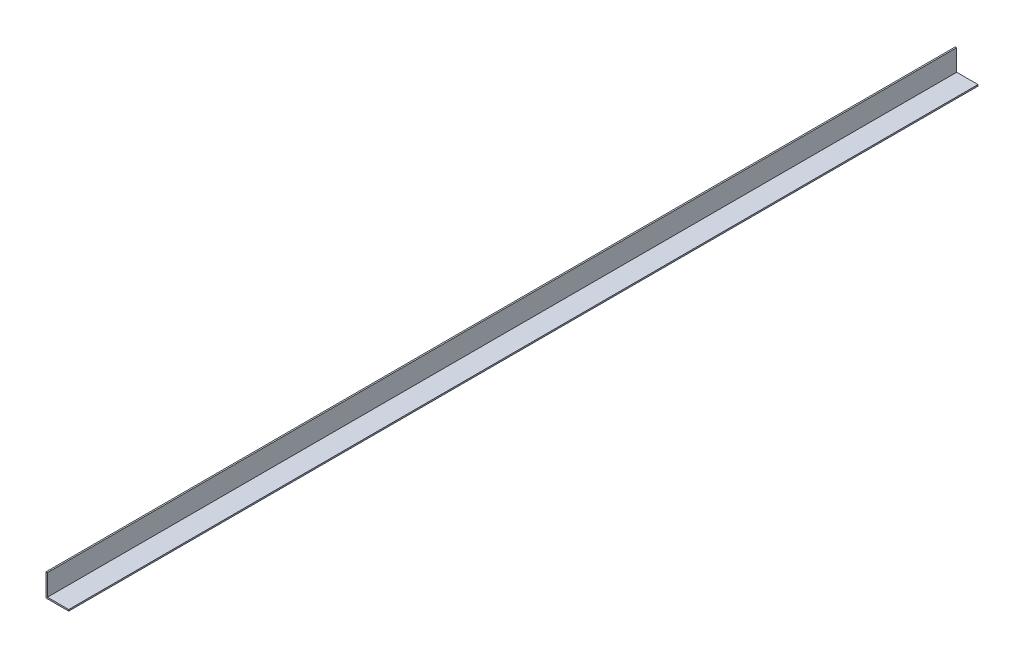
ISO-10303-21;
HEADER;
FILE_DESCRIPTION(('STEP AP214'),'2;1');
FILE_NAME('part.step','',(''),(''),'','','');
FILE_SCHEMA(('AUTOMOTIVE_DESIGN { 1 0 10303 214 1 1 1 1 }'));
ENDSEC;
DATA;
#1=APPLICATION_CONTEXT('core data for automotive mechanical design processes');
#2=APPLICATION_PROTOCOL_DEFINITION('international standard','automotive_design',2000,#1);
#3=PRODUCT_CONTEXT('',#1,'mechanical');
#4=PRODUCT('Part','Part','',(#3));
#5=PRODUCT_RELATED_PRODUCT_CATEGORY('part','',(#4));
#6=PRODUCT_DEFINITION_FORMATION('','',#4);
#7=PRODUCT_DEFINITION_CONTEXT('part definition',#1,'design');
#8=PRODUCT_DEFINITION('design','',#6,#7);
#9=PRODUCT_DEFINITION_SHAPE('','',#8);
#10=(LENGTH_UNIT() NAMED_UNIT(*) SI_UNIT(.MILLI.,.METRE.));
#11=(NAMED_UNIT(*) PLANE_ANGLE_UNIT() SI_UNIT($,.RADIAN.));
#12=(NAMED_UNIT(*) SI_UNIT($,.STERADIAN.) SOLID_ANGLE_UNIT());
#13=UNCERTAINTY_MEASURE_WITH_UNIT(LENGTH_MEASURE(1.E-05),#10,'distance_accuracy_value','');
#14=(GEOMETRIC_REPRESENTATION_CONTEXT(3) GLOBAL_UNCERTAINTY_ASSIGNED_CONTEXT((#13)) GLOBAL_UNIT_ASSIGNED_CONTEXT((#10,
#11,#12)) REPRESENTATION_CONTEXT('',''));
#15=CARTESIAN_POINT('',(0.,0.,0.));
#16=DIRECTION('',(0.,0.,1.));
#17=DIRECTION('',(1.,0.,0.));
#18=AXIS2_PLACEMENT_3D('',#15,#16,#17);
#19=CARTESIAN_POINT('',(9.53,152.4,-6100.));
#20=DIRECTION('',(0.,1.,0.));
#21=DIRECTION('',(0.,0.,1.));
#22=AXIS2_PLACEMENT_3D('',#19,#20,#21);
#23=PLANE('',#22);
#24=DIRECTION('',(-1.,0.,0.));
#25=VECTOR('',#24,1.);
#26=CARTESIAN_POINT('',(9.53,152.4,0.));
#27=LINE('',#26,#25);
#28=CARTESIAN_POINT('',(9.53,152.4,0.));
#29=VERTEX_POINT('',#28);
#30=CARTESIAN_POINT('',(0.,152.4,0.));
#31=VERTEX_POINT('',#30);
#32=EDGE_CURVE('E118',#29,#31,#27,.T.);
#33=ORIENTED_EDGE('',*,*,#32,.F.);
#34=DIRECTION('',(0.,0.,1.));
#35=VECTOR('',#34,1.);
#36=CARTESIAN_POINT('',(9.53,152.4,-6100.));
#37=LINE('',#36,#35);
#38=CARTESIAN_POINT('',(9.53,152.4,-6100.));
#39=VERTEX_POINT('',#38);
#40=EDGE_CURVE('E11',#39,#29,#37,.T.);
#41=ORIENTED_EDGE('',*,*,#40,.F.);
#42=DIRECTION('',(-1.,0.,0.));
#43=VECTOR('',#42,1.);
#44=CARTESIAN_POINT('',(9.53,152.4,-6100.));
#45=LINE('',#44,#43);
#46=CARTESIAN_POINT('',(0.,152.4,-6100.));
#47=VERTEX_POINT('',#46);
#48=EDGE_CURVE('E132',#39,#47,#45,.T.);
#49=ORIENTED_EDGE('',*,*,#48,.T.);
#50=DIRECTION('',(0.,0.,1.));
#51=VECTOR('',#50,1.);
#52=CARTESIAN_POINT('',(0.,152.4,-6100.));
#53=LINE('',#52,#51);
#54=EDGE_CURVE('E36',#47,#31,#53,.T.);
#55=ORIENTED_EDGE('',*,*,#54,.T.);
#56=EDGE_LOOP('',(#33,#41,#49,#55));
#57=FACE_BOUND('',#56,.T.);
#58=ADVANCED_FACE('F33',(#57),#23,.T.);
#59=CARTESIAN_POINT('',(9.53,9.52999999999999,-6100.));
#60=DIRECTION('',(1.,0.,0.));
#61=DIRECTION('',(0.,1.,0.));
#62=AXIS2_PLACEMENT_3D('',#59,#60,#61);
#63=PLANE('',#62);
#64=DIRECTION('',(0.,1.,0.));
#65=VECTOR('',#64,1.);
#66=CARTESIAN_POINT('',(9.53,9.52999999999999,0.));
#67=LINE('',#66,#65);
#68=CARTESIAN_POINT('',(9.53,9.52999999999999,0.));
#69=VERTEX_POINT('',#68);
#70=EDGE_CURVE('E130',#69,#29,#67,.T.);
#71=ORIENTED_EDGE('',*,*,#70,.F.);
#72=DIRECTION('',(0.,0.,1.));
#73=VECTOR('',#72,1.);
#74=CARTESIAN_POINT('',(9.53,9.52999999999999,-6100.));
#75=LINE('',#74,#73);
#76=CARTESIAN_POINT('',(9.53,9.52999999999999,-6100.));
#77=VERTEX_POINT('',#76);
#78=EDGE_CURVE('E42',#77,#69,#75,.T.);
#79=ORIENTED_EDGE('',*,*,#78,.F.);
#80=DIRECTION('',(0.,1.,0.));
#81=VECTOR('',#80,1.);
#82=CARTESIAN_POINT('',(9.53,9.52999999999999,-6100.));
#83=LINE('',#82,#81);
#84=EDGE_CURVE('E108',#77,#39,#83,.T.);
#85=ORIENTED_EDGE('',*,*,#84,.T.);
#86=ORIENTED_EDGE('',*,*,#40,.T.);
#87=EDGE_LOOP('',(#71,#79,#85,#86));
#88=FACE_BOUND('',#87,.T.);
#89=ADVANCED_FACE('F140',(#88),#63,.T.);
#90=CARTESIAN_POINT('',(152.4,9.53,-6100.));
#91=DIRECTION('',(0.,1.,0.));
#92=DIRECTION('',(-1.,0.,0.));
#93=AXIS2_PLACEMENT_3D('',#90,#91,#92);
#94=PLANE('',#93);
#95=DIRECTION('',(-1.,0.,0.));
#96=VECTOR('',#95,1.);
#97=CARTESIAN_POINT('',(152.4,9.53,0.));
#98=LINE('',#97,#96);
#99=CARTESIAN_POINT('',(152.4,9.53,0.));
#100=VERTEX_POINT('',#99);
#101=EDGE_CURVE('E95',#100,#69,#98,.T.);
#102=ORIENTED_EDGE('',*,*,#101,.F.);
#103=DIRECTION('',(0.,0.,1.));
#104=VECTOR('',#103,1.);
#105=CARTESIAN_POINT('',(152.4,9.53,-6100.));
#106=LINE('',#105,#104);
#107=CARTESIAN_POINT('',(152.4,9.53,-6100.));
#108=VERTEX_POINT('',#107);
#109=EDGE_CURVE('E90',#108,#100,#106,.T.);
#110=ORIENTED_EDGE('',*,*,#109,.F.);
#111=DIRECTION('',(-1.,0.,0.));
#112=VECTOR('',#111,1.);
#113=CARTESIAN_POINT('',(152.4,9.53,-6100.));
#114=LINE('',#113,#112);
#115=EDGE_CURVE('E93',#108,#77,#114,.T.);
#116=ORIENTED_EDGE('',*,*,#115,.T.);
#117=ORIENTED_EDGE('',*,*,#78,.T.);
#118=EDGE_LOOP('',(#102,#110,#116,#117));
#119=FACE_BOUND('',#118,.T.);
#120=ADVANCED_FACE('F92',(#119),#94,.T.);
#121=CARTESIAN_POINT('',(152.4,0.,-6100.));
#122=DIRECTION('',(1.,0.,0.));
#123=DIRECTION('',(0.,0.,-1.));
#124=AXIS2_PLACEMENT_3D('',#121,#122,#123);
#125=PLANE('',#124);
#126=DIRECTION('',(0.,1.,0.));
#127=VECTOR('',#126,1.);
#128=CARTESIAN_POINT('',(152.4,0.,0.));
#129=LINE('',#128,#127);
#130=CARTESIAN_POINT('',(152.4,0.,0.));
#131=VERTEX_POINT('',#130);
#132=EDGE_CURVE('E127',#131,#100,#129,.T.);
#133=ORIENTED_EDGE('',*,*,#132,.F.);
#134=DIRECTION('',(0.,0.,1.));
#135=VECTOR('',#134,1.);
#136=CARTESIAN_POINT('',(152.4,0.,-6100.));
#137=LINE('',#136,#135);
#138=CARTESIAN_POINT('',(152.4,0.,-6100.));
#139=VERTEX_POINT('',#138);
#140=EDGE_CURVE('E100',#139,#131,#137,.T.);
#141=ORIENTED_EDGE('',*,*,#140,.F.);
#142=DIRECTION('',(0.,1.,0.));
#143=VECTOR('',#142,1.);
#144=CARTESIAN_POINT('',(152.4,0.,-6100.));
#145=LINE('',#144,#143);
#146=EDGE_CURVE('E106',#139,#108,#145,.T.);
#147=ORIENTED_EDGE('',*,*,#146,.T.);
#148=ORIENTED_EDGE('',*,*,#109,.T.);
#149=EDGE_LOOP('',(#133,#141,#147,#148));
#150=FACE_BOUND('',#149,.T.);
#151=ADVANCED_FACE('F110',(#150),#125,.T.);
#152=CARTESIAN_POINT('',(0.,0.,-6100.));
#153=DIRECTION('',(0.,-1.,0.));
#154=DIRECTION('',(0.,0.,-1.));
#155=AXIS2_PLACEMENT_3D('',#152,#153,#154);
#156=PLANE('',#155);
#157=DIRECTION('',(1.,0.,0.));
#158=VECTOR('',#157,1.);
#159=CARTESIAN_POINT('',(0.,0.,0.));
#160=LINE('',#159,#158);
#161=CARTESIAN_POINT('',(0.,0.,0.));
#162=VERTEX_POINT('',#161);
#163=EDGE_CURVE('E124',#162,#131,#160,.T.);
#164=ORIENTED_EDGE('',*,*,#163,.F.);
#165=DIRECTION('',(0.,0.,1.));
#166=VECTOR('',#165,1.);
#167=CARTESIAN_POINT('',(0.,0.,-6100.));
#168=LINE('',#167,#166);
#169=CARTESIAN_POINT('',(0.,0.,-6100.));
#170=VERTEX_POINT('',#169);
#171=EDGE_CURVE('E135',#170,#162,#168,.T.);
#172=ORIENTED_EDGE('',*,*,#171,.F.);
#173=DIRECTION('',(1.,0.,0.));
#174=VECTOR('',#173,1.);
#175=CARTESIAN_POINT('',(0.,0.,-6100.));
#176=LINE('',#175,#174);
#177=EDGE_CURVE('E111',#170,#139,#176,.T.);
#178=ORIENTED_EDGE('',*,*,#177,.T.);
#179=ORIENTED_EDGE('',*,*,#140,.T.);
#180=EDGE_LOOP('',(#164,#172,#178,#179));
#181=FACE_BOUND('',#180,.T.);
#182=ADVANCED_FACE('F153',(#181),#156,.T.);
#183=CARTESIAN_POINT('',(0.,152.4,-6100.));
#184=DIRECTION('',(-1.,0.,0.));
#185=DIRECTION('',(0.,-1.,0.));
#186=AXIS2_PLACEMENT_3D('',#183,#184,#185);
#187=PLANE('',#186);
#188=DIRECTION('',(0.,-1.,0.));
#189=VECTOR('',#188,1.);
#190=CARTESIAN_POINT('',(0.,152.4,0.));
#191=LINE('',#190,#189);
#192=EDGE_CURVE('E121',#31,#162,#191,.T.);
#193=ORIENTED_EDGE('',*,*,#192,.F.);
#194=ORIENTED_EDGE('',*,*,#54,.F.);
#195=DIRECTION('',(0.,-1.,0.));
#196=VECTOR('',#195,1.);
#197=CARTESIAN_POINT('',(0.,152.4,-6100.));
#198=LINE('',#197,#196);
#199=EDGE_CURVE('E113',#47,#170,#198,.T.);
#200=ORIENTED_EDGE('',*,*,#199,.T.);
#201=ORIENTED_EDGE('',*,*,#171,.T.);
#202=EDGE_LOOP('',(#193,#194,#200,#201));
#203=FACE_BOUND('',#202,.T.);
#204=ADVANCED_FACE('F137',(#203),#187,.T.);
#205=CARTESIAN_POINT('',(0.,0.,-6100.));
#206=DIRECTION('',(0.,0.,1.));
#207=DIRECTION('',(1.,0.,0.));
#208=AXIS2_PLACEMENT_3D('',#205,#206,#207);
#209=PLANE('',#208);
#210=ORIENTED_EDGE('',*,*,#48,.F.);
#211=ORIENTED_EDGE('',*,*,#84,.F.);
#212=ORIENTED_EDGE('',*,*,#115,.F.);
#213=ORIENTED_EDGE('',*,*,#146,.F.);
#214=ORIENTED_EDGE('',*,*,#177,.F.);
#215=ORIENTED_EDGE('',*,*,#199,.F.);
#216=EDGE_LOOP('',(#210,#211,#212,#213,#214,#215));
#217=FACE_BOUND('',#216,.T.);
#218=ADVANCED_FACE('F104',(#217),#209,.F.);
#219=CARTESIAN_POINT('',(0.,0.,0.));
#220=DIRECTION('',(0.,0.,1.));
#221=DIRECTION('',(1.,0.,0.));
#222=AXIS2_PLACEMENT_3D('',#219,#220,#221);
#223=PLANE('',#222);
#224=ORIENTED_EDGE('',*,*,#32,.T.);
#225=ORIENTED_EDGE('',*,*,#192,.T.);
#226=ORIENTED_EDGE('',*,*,#163,.T.);
#227=ORIENTED_EDGE('',*,*,#132,.T.);
#228=ORIENTED_EDGE('',*,*,#101,.T.);
#229=ORIENTED_EDGE('',*,*,#70,.T.);
#230=EDGE_LOOP('',(#224,#225,#226,#227,#228,#229));
#231=FACE_BOUND('',#230,.T.);
#232=ADVANCED_FACE('F139',(#231),#223,.T.);
#233=CLOSED_SHELL('',(#58,#89,#120,#151,#182,#204,#218,#232));
#234=MANIFOLD_SOLID_BREP('B2',#233);
#235=ADVANCED_BREP_SHAPE_REPRESENTATION('',(#18,#234),#14);
#236=SHAPE_DEFINITION_REPRESENTATION(#9,#235);
ENDSEC;
END-ISO-10303-21;
